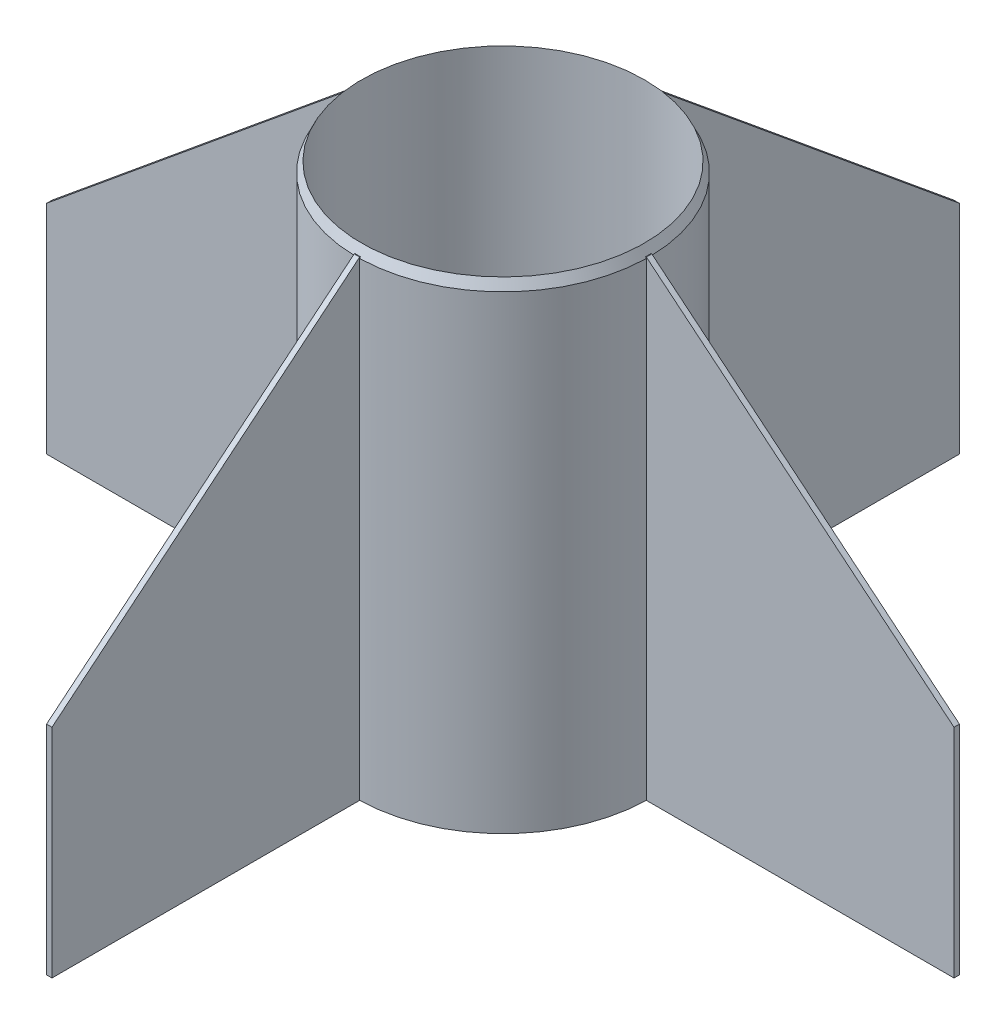
ISO-10303-21;
HEADER;
FILE_DESCRIPTION(('STEP AP214'),'2;1');
FILE_NAME('part.step','',(''),(''),'','','');
FILE_SCHEMA(('AUTOMOTIVE_DESIGN { 1 0 10303 214 1 1 1 1 }'));
ENDSEC;
DATA;
#1=APPLICATION_CONTEXT('core data for automotive mechanical design processes');
#2=APPLICATION_PROTOCOL_DEFINITION('international standard','automotive_design',2000,#1);
#3=PRODUCT_CONTEXT('',#1,'mechanical');
#4=PRODUCT('Part','Part','',(#3));
#5=PRODUCT_RELATED_PRODUCT_CATEGORY('part','',(#4));
#6=PRODUCT_DEFINITION_FORMATION('','',#4);
#7=PRODUCT_DEFINITION_CONTEXT('part definition',#1,'design');
#8=PRODUCT_DEFINITION('design','',#6,#7);
#9=PRODUCT_DEFINITION_SHAPE('','',#8);
#10=(LENGTH_UNIT() NAMED_UNIT(*) SI_UNIT(.MILLI.,.METRE.));
#11=(NAMED_UNIT(*) PLANE_ANGLE_UNIT() SI_UNIT($,.RADIAN.));
#12=(NAMED_UNIT(*) SI_UNIT($,.STERADIAN.) SOLID_ANGLE_UNIT());
#13=UNCERTAINTY_MEASURE_WITH_UNIT(LENGTH_MEASURE(1.E-05),#10,'distance_accuracy_value','');
#14=(GEOMETRIC_REPRESENTATION_CONTEXT(3) GLOBAL_UNCERTAINTY_ASSIGNED_CONTEXT((#13)) GLOBAL_UNIT_ASSIGNED_CONTEXT((#10,
#11,#12)) REPRESENTATION_CONTEXT('',''));
#15=CARTESIAN_POINT('',(0.,0.,0.));
#16=DIRECTION('',(0.,0.,1.));
#17=DIRECTION('',(1.,0.,0.));
#18=AXIS2_PLACEMENT_3D('',#15,#16,#17);
#19=CARTESIAN_POINT('',(0.,260.,0.));
#20=DIRECTION('',(0.,-1.,0.));
#21=DIRECTION('',(0.,0.,-1.));
#22=AXIS2_PLACEMENT_3D('',#19,#20,#21);
#23=CYLINDRICAL_SURFACE('',#22,80.7);
#24=DIRECTION('',(0.,-1.,0.));
#25=VECTOR('',#24,1.);
#26=CARTESIAN_POINT('',(-80.6860582752684,260.,-1.5));
#27=LINE('',#26,#25);
#28=CARTESIAN_POINT('',(-80.6860582752684,0.,-1.5));
#29=VERTEX_POINT('',#28);
#30=CARTESIAN_POINT('',(-80.6860582752684,259.277465397452,-1.5));
#31=VERTEX_POINT('',#30);
#32=EDGE_CURVE('E332',#29,#31,#27,.F.);
#33=ORIENTED_EDGE('',*,*,#32,.T.);
#34=CARTESIAN_POINT('',(0.,259.277465397452,0.));
#35=DIRECTION('',(0.,1.,0.));
#36=DIRECTION('',(0.,0.,1.));
#37=AXIS2_PLACEMENT_3D('',#34,#35,#36);
#38=CIRCLE('',#37,80.7);
#39=CARTESIAN_POINT('',(-1.49999999999915,259.277465397452,-80.6860582752684));
#40=VERTEX_POINT('',#39);
#41=EDGE_CURVE('E455',#31,#40,#38,.F.);
#42=ORIENTED_EDGE('',*,*,#41,.T.);
#43=DIRECTION('',(0.,-1.,0.));
#44=VECTOR('',#43,1.);
#45=CARTESIAN_POINT('',(-1.49999999999915,260.,-80.6860582752684));
#46=LINE('',#45,#44);
#47=CARTESIAN_POINT('',(-1.49999999999915,0.,-80.6860582752684));
#48=VERTEX_POINT('',#47);
#49=EDGE_CURVE('E291',#48,#40,#46,.F.);
#50=ORIENTED_EDGE('',*,*,#49,.F.);
#51=CARTESIAN_POINT('',(0.,0.,0.));
#52=DIRECTION('',(0.,1.,0.));
#53=DIRECTION('',(0.,0.,1.));
#54=AXIS2_PLACEMENT_3D('',#51,#52,#53);
#55=CIRCLE('',#54,80.7);
#56=EDGE_CURVE('E434',#48,#29,#55,.T.);
#57=ORIENTED_EDGE('',*,*,#56,.T.);
#58=EDGE_LOOP('',(#33,#42,#50,#57));
#59=FACE_BOUND('',#58,.T.);
#60=ADVANCED_FACE('F43',(#59),#23,.T.);
#61=DIRECTION('',(0.,-1.,0.));
#62=VECTOR('',#61,1.);
#63=CARTESIAN_POINT('',(1.50000000000085,260.,-80.6860582752683));
#64=LINE('',#63,#62);
#65=CARTESIAN_POINT('',(1.50000000000085,0.,-80.6860582752683));
#66=VERTEX_POINT('',#65);
#67=CARTESIAN_POINT('',(1.50000000000085,259.277465397452,-80.6860582752683));
#68=VERTEX_POINT('',#67);
#69=EDGE_CURVE('E241',#66,#68,#64,.F.);
#70=ORIENTED_EDGE('',*,*,#69,.T.);
#71=CARTESIAN_POINT('',(0.,259.277465397452,0.));
#72=DIRECTION('',(0.,1.,0.));
#73=DIRECTION('',(0.,0.,1.));
#74=AXIS2_PLACEMENT_3D('',#71,#72,#73);
#75=CIRCLE('',#74,80.7);
#76=CARTESIAN_POINT('',(80.6860582752684,259.277465397452,-1.5));
#77=VERTEX_POINT('',#76);
#78=EDGE_CURVE('E452',#68,#77,#75,.F.);
#79=ORIENTED_EDGE('',*,*,#78,.T.);
#80=DIRECTION('',(0.,-1.,0.));
#81=VECTOR('',#80,1.);
#82=CARTESIAN_POINT('',(80.6860582752684,260.,-1.5));
#83=LINE('',#82,#81);
#84=CARTESIAN_POINT('',(80.6860582752684,0.,-1.5));
#85=VERTEX_POINT('',#84);
#86=EDGE_CURVE('E438',#85,#77,#83,.F.);
#87=ORIENTED_EDGE('',*,*,#86,.F.);
#88=EDGE_CURVE('E430',#85,#66,#55,.T.);
#89=ORIENTED_EDGE('',*,*,#88,.T.);
#90=EDGE_LOOP('',(#70,#79,#87,#89));
#91=FACE_BOUND('',#90,.T.);
#92=ADVANCED_FACE('F611',(#91),#23,.T.);
#93=DIRECTION('',(0.,-1.,0.));
#94=VECTOR('',#93,1.);
#95=CARTESIAN_POINT('',(80.6860582752684,260.,1.5));
#96=LINE('',#95,#94);
#97=CARTESIAN_POINT('',(80.6860582752684,0.,1.5));
#98=VERTEX_POINT('',#97);
#99=CARTESIAN_POINT('',(80.6860582752684,259.277465397452,1.5));
#100=VERTEX_POINT('',#99);
#101=EDGE_CURVE('E433',#98,#100,#96,.F.);
#102=ORIENTED_EDGE('',*,*,#101,.T.);
#103=CARTESIAN_POINT('',(0.,259.277465397452,0.));
#104=DIRECTION('',(0.,1.,0.));
#105=DIRECTION('',(0.,0.,1.));
#106=AXIS2_PLACEMENT_3D('',#103,#104,#105);
#107=CIRCLE('',#106,80.7);
#108=CARTESIAN_POINT('',(1.49999999999972,259.277465397452,80.6860582752684));
#109=VERTEX_POINT('',#108);
#110=EDGE_CURVE('E449',#100,#109,#107,.F.);
#111=ORIENTED_EDGE('',*,*,#110,.T.);
#112=DIRECTION('',(0.,-1.,0.));
#113=VECTOR('',#112,1.);
#114=CARTESIAN_POINT('',(1.49999999999972,260.,80.6860582752684));
#115=LINE('',#114,#113);
#116=CARTESIAN_POINT('',(1.49999999999972,0.,80.6860582752684));
#117=VERTEX_POINT('',#116);
#118=EDGE_CURVE('E384',#117,#109,#115,.F.);
#119=ORIENTED_EDGE('',*,*,#118,.F.);
#120=EDGE_CURVE('E429',#117,#98,#55,.T.);
#121=ORIENTED_EDGE('',*,*,#120,.T.);
#122=EDGE_LOOP('',(#102,#111,#119,#121));
#123=FACE_BOUND('',#122,.T.);
#124=ADVANCED_FACE('F537',(#123),#23,.T.);
#125=DIRECTION('',(0.,-1.,0.));
#126=VECTOR('',#125,1.);
#127=CARTESIAN_POINT('',(-1.50000000000028,260.,80.6860582752684));
#128=LINE('',#127,#126);
#129=CARTESIAN_POINT('',(-1.50000000000028,0.,80.6860582752684));
#130=VERTEX_POINT('',#129);
#131=CARTESIAN_POINT('',(-1.50000000000028,259.277465397452,80.6860582752684));
#132=VERTEX_POINT('',#131);
#133=EDGE_CURVE('E380',#130,#132,#128,.F.);
#134=ORIENTED_EDGE('',*,*,#133,.T.);
#135=CARTESIAN_POINT('',(0.,259.277465397452,0.));
#136=DIRECTION('',(0.,1.,0.));
#137=DIRECTION('',(0.,0.,1.));
#138=AXIS2_PLACEMENT_3D('',#135,#136,#137);
#139=CIRCLE('',#138,80.7);
#140=CARTESIAN_POINT('',(-80.6860582752684,259.277465397452,1.5));
#141=VERTEX_POINT('',#140);
#142=EDGE_CURVE('E446',#132,#141,#139,.F.);
#143=ORIENTED_EDGE('',*,*,#142,.T.);
#144=DIRECTION('',(0.,-1.,0.));
#145=VECTOR('',#144,1.);
#146=CARTESIAN_POINT('',(-80.6860582752684,260.,1.5));
#147=LINE('',#146,#145);
#148=CARTESIAN_POINT('',(-80.6860582752684,0.,1.5));
#149=VERTEX_POINT('',#148);
#150=EDGE_CURVE('E336',#149,#141,#147,.F.);
#151=ORIENTED_EDGE('',*,*,#150,.F.);
#152=EDGE_CURVE('E527',#149,#130,#55,.T.);
#153=ORIENTED_EDGE('',*,*,#152,.T.);
#154=EDGE_LOOP('',(#134,#143,#151,#153));
#155=FACE_BOUND('',#154,.T.);
#156=ADVANCED_FACE('F617',(#155),#23,.T.);
#157=CARTESIAN_POINT('',(0.,260.,0.));
#158=DIRECTION('',(0.,1.,0.));
#159=DIRECTION('',(0.,0.,1.));
#160=AXIS2_PLACEMENT_3D('',#157,#158,#159);
#161=PLANE('',#160);
#162=DIRECTION('',(-1.,0.,0.));
#163=VECTOR('',#162,1.);
#164=CARTESIAN_POINT('',(80.7,260.,-1.5));
#165=LINE('',#164,#163);
#166=CARTESIAN_POINT('',(80.7,260.,-1.5));
#167=VERTEX_POINT('',#166);
#168=CARTESIAN_POINT('',(80.3490763957623,260.,-1.5));
#169=VERTEX_POINT('',#168);
#170=EDGE_CURVE('E98',#167,#169,#165,.T.);
#171=ORIENTED_EDGE('',*,*,#170,.T.);
#172=CARTESIAN_POINT('',(0.,260.,0.));
#173=DIRECTION('',(0.,1.,0.));
#174=DIRECTION('',(0.,0.,1.));
#175=AXIS2_PLACEMENT_3D('',#172,#173,#174);
#176=CIRCLE('',#175,80.3630765815499);
#177=CARTESIAN_POINT('',(80.3490763957623,260.,1.5));
#178=VERTEX_POINT('',#177);
#179=EDGE_CURVE('E555',#169,#178,#176,.F.);
#180=ORIENTED_EDGE('',*,*,#179,.T.);
#181=DIRECTION('',(-1.,0.,0.));
#182=VECTOR('',#181,1.);
#183=CARTESIAN_POINT('',(80.7,260.,1.5));
#184=LINE('',#183,#182);
#185=CARTESIAN_POINT('',(80.7,260.,1.5));
#186=VERTEX_POINT('',#185);
#187=EDGE_CURVE('E91',#186,#178,#184,.T.);
#188=ORIENTED_EDGE('',*,*,#187,.F.);
#189=DIRECTION('',(0.,0.,1.));
#190=VECTOR('',#189,1.);
#191=CARTESIAN_POINT('',(80.7,260.,-1.5));
#192=LINE('',#191,#190);
#193=CARTESIAN_POINT('',(80.7,260.,0.));
#194=VERTEX_POINT('',#193);
#195=EDGE_CURVE('E420',#194,#186,#192,.T.);
#196=ORIENTED_EDGE('',*,*,#195,.F.);
#197=EDGE_CURVE('E421',#167,#194,#192,.T.);
#198=ORIENTED_EDGE('',*,*,#197,.F.);
#199=EDGE_LOOP('',(#171,#180,#188,#196,#198));
#200=FACE_BOUND('',#199,.T.);
#201=ADVANCED_FACE('F553',(#200),#161,.T.);
#202=CARTESIAN_POINT('',(0.,0.,0.));
#203=DIRECTION('',(0.,1.,0.));
#204=DIRECTION('',(0.,0.,1.));
#205=AXIS2_PLACEMENT_3D('',#202,#203,#204);
#206=PLANE('',#205);
#207=ORIENTED_EDGE('',*,*,#152,.F.);
#208=DIRECTION('',(-1.,0.,0.));
#209=VECTOR('',#208,1.);
#210=CARTESIAN_POINT('',(-78.7,0.,1.5));
#211=LINE('',#210,#209);
#212=CARTESIAN_POINT('',(-250.7,0.,1.5));
#213=VERTEX_POINT('',#212);
#214=EDGE_CURVE('E324',#149,#213,#211,.T.);
#215=ORIENTED_EDGE('',*,*,#214,.T.);
#216=DIRECTION('',(0.,0.,-1.));
#217=VECTOR('',#216,1.);
#218=CARTESIAN_POINT('',(-250.7,0.,1.5));
#219=LINE('',#218,#217);
#220=CARTESIAN_POINT('',(-250.7,0.,-1.5));
#221=VERTEX_POINT('',#220);
#222=EDGE_CURVE('E310',#213,#221,#219,.T.);
#223=ORIENTED_EDGE('',*,*,#222,.T.);
#224=DIRECTION('',(-1.,0.,0.));
#225=VECTOR('',#224,1.);
#226=CARTESIAN_POINT('',(-78.7,0.,-1.5));
#227=LINE('',#226,#225);
#228=EDGE_CURVE('E319',#29,#221,#227,.T.);
#229=ORIENTED_EDGE('',*,*,#228,.F.);
#230=ORIENTED_EDGE('',*,*,#56,.F.);
#231=DIRECTION('',(0.,0.,-1.));
#232=VECTOR('',#231,1.);
#233=CARTESIAN_POINT('',(-1.49999999999918,0.,-78.7));
#234=LINE('',#233,#232);
#235=CARTESIAN_POINT('',(-1.49999999999737,0.,-250.7));
#236=VERTEX_POINT('',#235);
#237=EDGE_CURVE('E255',#48,#236,#234,.T.);
#238=ORIENTED_EDGE('',*,*,#237,.T.);
#239=DIRECTION('',(1.,0.,0.));
#240=VECTOR('',#239,1.);
#241=CARTESIAN_POINT('',(-1.49999999999737,0.,-250.7));
#242=LINE('',#241,#240);
#243=CARTESIAN_POINT('',(1.50000000000263,0.,-250.7));
#244=VERTEX_POINT('',#243);
#245=EDGE_CURVE('E250',#236,#244,#242,.T.);
#246=ORIENTED_EDGE('',*,*,#245,.T.);
#247=DIRECTION('',(0.,0.,-1.));
#248=VECTOR('',#247,1.);
#249=CARTESIAN_POINT('',(1.50000000000082,0.,-78.7));
#250=LINE('',#249,#248);
#251=EDGE_CURVE('E233',#66,#244,#250,.T.);
#252=ORIENTED_EDGE('',*,*,#251,.F.);
#253=ORIENTED_EDGE('',*,*,#88,.F.);
#254=DIRECTION('',(1.,0.,0.));
#255=VECTOR('',#254,1.);
#256=CARTESIAN_POINT('',(78.7,0.,-1.5));
#257=LINE('',#256,#255);
#258=CARTESIAN_POINT('',(250.7,0.,-1.5));
#259=VERTEX_POINT('',#258);
#260=EDGE_CURVE('E417',#85,#259,#257,.T.);
#261=ORIENTED_EDGE('',*,*,#260,.T.);
#262=DIRECTION('',(0.,0.,1.));
#263=VECTOR('',#262,1.);
#264=CARTESIAN_POINT('',(250.7,0.,-1.5));
#265=LINE('',#264,#263);
#266=CARTESIAN_POINT('',(250.7,0.,1.5));
#267=VERTEX_POINT('',#266);
#268=EDGE_CURVE('E403',#259,#267,#265,.T.);
#269=ORIENTED_EDGE('',*,*,#268,.T.);
#270=DIRECTION('',(1.,0.,0.));
#271=VECTOR('',#270,1.);
#272=CARTESIAN_POINT('',(78.7,0.,1.5));
#273=LINE('',#272,#271);
#274=EDGE_CURVE('E412',#98,#267,#273,.T.);
#275=ORIENTED_EDGE('',*,*,#274,.F.);
#276=ORIENTED_EDGE('',*,*,#120,.F.);
#277=DIRECTION('',(0.,0.,1.));
#278=VECTOR('',#277,1.);
#279=CARTESIAN_POINT('',(1.49999999999973,0.,78.7));
#280=LINE('',#279,#278);
#281=CARTESIAN_POINT('',(1.49999999999912,0.,250.7));
#282=VERTEX_POINT('',#281);
#283=EDGE_CURVE('E372',#117,#282,#280,.T.);
#284=ORIENTED_EDGE('',*,*,#283,.T.);
#285=DIRECTION('',(-1.,0.,0.));
#286=VECTOR('',#285,1.);
#287=CARTESIAN_POINT('',(1.49999999999912,0.,250.7));
#288=LINE('',#287,#286);
#289=CARTESIAN_POINT('',(-1.50000000000088,0.,250.7));
#290=VERTEX_POINT('',#289);
#291=EDGE_CURVE('E356',#282,#290,#288,.T.);
#292=ORIENTED_EDGE('',*,*,#291,.T.);
#293=DIRECTION('',(0.,0.,1.));
#294=VECTOR('',#293,1.);
#295=CARTESIAN_POINT('',(-1.50000000000027,0.,78.7));
#296=LINE('',#295,#294);
#297=EDGE_CURVE('E366',#130,#290,#296,.T.);
#298=ORIENTED_EDGE('',*,*,#297,.F.);
#299=EDGE_LOOP('',(#207,#215,#223,#229,#230,#238,#246,#252,#253,#261,#269,#275,#276,#284,#292,#298));
#300=FACE_BOUND('',#299,.T.);
#301=CARTESIAN_POINT('',(0.,0.,0.));
#302=DIRECTION('',(0.,1.,0.));
#303=DIRECTION('',(0.,0.,1.));
#304=AXIS2_PLACEMENT_3D('',#301,#302,#303);
#305=CIRCLE('',#304,78.2);
#306=CARTESIAN_POINT('',(0.,0.,78.2));
#307=VERTEX_POINT('',#306);
#308=EDGE_CURVE('E425',#307,#307,#305,.T.);
#309=ORIENTED_EDGE('',*,*,#308,.T.);
#310=EDGE_LOOP('',(#309));
#311=FACE_BOUND('',#310,.T.);
#312=ADVANCED_FACE('F252',(#300,#311),#206,.F.);
#313=CARTESIAN_POINT('',(0.,260.,0.));
#314=DIRECTION('',(0.,-1.,0.));
#315=DIRECTION('',(0.,0.,-1.));
#316=AXIS2_PLACEMENT_3D('',#313,#314,#315);
#317=CYLINDRICAL_SURFACE('',#316,78.2);
#318=CARTESIAN_POINT('',(0.,264.638732698726,0.));
#319=DIRECTION('',(0.,-1.,0.));
#320=DIRECTION('',(0.,0.,-1.));
#321=AXIS2_PLACEMENT_3D('',#318,#319,#320);
#322=CIRCLE('',#321,78.2);
#323=CARTESIAN_POINT('',(0.,264.638732698726,-78.2));
#324=VERTEX_POINT('',#323);
#325=EDGE_CURVE('E442',#324,#324,#322,.F.);
#326=ORIENTED_EDGE('',*,*,#325,.T.);
#327=EDGE_LOOP('',(#326));
#328=FACE_BOUND('',#327,.T.);
#329=ORIENTED_EDGE('',*,*,#308,.F.);
#330=EDGE_LOOP('',(#329));
#331=FACE_BOUND('',#330,.T.);
#332=ADVANCED_FACE('F588',(#328,#331),#317,.F.);
#333=CARTESIAN_POINT('',(0.,0.,-1.5));
#334=DIRECTION('',(0.,0.,1.));
#335=DIRECTION('',(1.,0.,0.));
#336=AXIS2_PLACEMENT_3D('',#333,#334,#335);
#337=PLANE('',#336);
#338=ORIENTED_EDGE('',*,*,#260,.F.);
#339=ORIENTED_EDGE('',*,*,#86,.T.);
#340=CARTESIAN_POINT('',(80.6860582752684,259.277465397452,-1.5));
#341=CARTESIAN_POINT('',(80.6298946621743,259.397887846829,-1.5));
#342=CARTESIAN_POINT('',(80.573731032335,259.518310288397,-1.5));
#343=CARTESIAN_POINT('',(80.4614037391664,259.759155155913,-1.5));
#344=CARTESIAN_POINT('',(80.4052400758369,259.879577581861,-1.5));
#345=CARTESIAN_POINT('',(80.3490763957623,260.,-1.5));
#346=B_SPLINE_CURVE_WITH_KNOTS('',3,(#340,#341,#342,#343,#344,#345),.UNSPECIFIED.,.F.,.F.,(4,2,
4),(0.,0.398626717304128,0.797253434608295),.UNSPECIFIED.);
#347=EDGE_CURVE('E558',#77,#169,#346,.T.);
#348=ORIENTED_EDGE('',*,*,#347,.T.);
#349=ORIENTED_EDGE('',*,*,#170,.F.);
#350=DIRECTION('',(-0.77193023561705,0.6357072528611,0.));
#351=VECTOR('',#350,1.);
#352=CARTESIAN_POINT('',(250.7,120.,-1.5));
#353=LINE('',#352,#351);
#354=CARTESIAN_POINT('',(250.7,120.,-1.5));
#355=VERTEX_POINT('',#354);
#356=EDGE_CURVE('E399',#355,#167,#353,.T.);
#357=ORIENTED_EDGE('',*,*,#356,.F.);
#358=DIRECTION('',(0.,1.,0.));
#359=VECTOR('',#358,1.);
#360=CARTESIAN_POINT('',(250.7,0.,-1.5));
#361=LINE('',#360,#359);
#362=EDGE_CURVE('E395',#259,#355,#361,.T.);
#363=ORIENTED_EDGE('',*,*,#362,.F.);
#364=EDGE_LOOP('',(#338,#339,#348,#349,#357,#363));
#365=FACE_BOUND('',#364,.T.);
#366=ADVANCED_FACE('F583',(#365),#337,.F.);
#367=CARTESIAN_POINT('',(0.,0.,1.5));
#368=DIRECTION('',(0.,0.,1.));
#369=DIRECTION('',(1.,0.,0.));
#370=AXIS2_PLACEMENT_3D('',#367,#368,#369);
#371=PLANE('',#370);
#372=ORIENTED_EDGE('',*,*,#101,.F.);
#373=ORIENTED_EDGE('',*,*,#274,.T.);
#374=DIRECTION('',(0.,1.,0.));
#375=VECTOR('',#374,1.);
#376=CARTESIAN_POINT('',(250.7,0.,1.5));
#377=LINE('',#376,#375);
#378=CARTESIAN_POINT('',(250.7,120.,1.5));
#379=VERTEX_POINT('',#378);
#380=EDGE_CURVE('E388',#267,#379,#377,.T.);
#381=ORIENTED_EDGE('',*,*,#380,.T.);
#382=DIRECTION('',(-0.77193023561705,0.6357072528611,0.));
#383=VECTOR('',#382,1.);
#384=CARTESIAN_POINT('',(250.7,120.,1.5));
#385=LINE('',#384,#383);
#386=EDGE_CURVE('E392',#379,#186,#385,.T.);
#387=ORIENTED_EDGE('',*,*,#386,.T.);
#388=ORIENTED_EDGE('',*,*,#187,.T.);
#389=CARTESIAN_POINT('',(80.3490763957623,260.,1.5));
#390=CARTESIAN_POINT('',(80.4052400758369,259.879577581861,1.5));
#391=CARTESIAN_POINT('',(80.4614037391664,259.759155155913,1.5));
#392=CARTESIAN_POINT('',(80.573731032335,259.518310288397,1.5));
#393=CARTESIAN_POINT('',(80.6298946621743,259.397887846829,1.5));
#394=CARTESIAN_POINT('',(80.6860582752684,259.277465397452,1.5));
#395=B_SPLINE_CURVE_WITH_KNOTS('',3,(#389,#390,#391,#392,#393,#394),.UNSPECIFIED.,.F.,.F.,(4,2,
4),(0.,0.398626717304167,0.797253434608301),.UNSPECIFIED.);
#396=EDGE_CURVE('E542',#178,#100,#395,.T.);
#397=ORIENTED_EDGE('',*,*,#396,.T.);
#398=EDGE_LOOP('',(#372,#373,#381,#387,#388,#397));
#399=FACE_BOUND('',#398,.T.);
#400=ADVANCED_FACE('F540',(#399),#371,.T.);
#401=CARTESIAN_POINT('',(250.7,120.,-1.5));
#402=DIRECTION('',(0.6357072528611,0.77193023561705,0.));
#403=DIRECTION('',(-0.77193023561705,0.6357072528611,0.));
#404=AXIS2_PLACEMENT_3D('',#401,#402,#403);
#405=PLANE('',#404);
#406=ORIENTED_EDGE('',*,*,#197,.T.);
#407=ORIENTED_EDGE('',*,*,#195,.T.);
#408=ORIENTED_EDGE('',*,*,#386,.F.);
#409=DIRECTION('',(0.,0.,1.));
#410=VECTOR('',#409,1.);
#411=CARTESIAN_POINT('',(250.7,120.,-1.5));
#412=LINE('',#411,#410);
#413=EDGE_CURVE('E404',#355,#379,#412,.T.);
#414=ORIENTED_EDGE('',*,*,#413,.F.);
#415=ORIENTED_EDGE('',*,*,#356,.T.);
#416=EDGE_LOOP('',(#406,#407,#408,#414,#415));
#417=FACE_BOUND('',#416,.T.);
#418=ADVANCED_FACE('F550',(#417),#405,.T.);
#419=CARTESIAN_POINT('',(250.7,0.,-1.5));
#420=DIRECTION('',(1.,0.,0.));
#421=DIRECTION('',(0.,0.,-1.));
#422=AXIS2_PLACEMENT_3D('',#419,#420,#421);
#423=PLANE('',#422);
#424=ORIENTED_EDGE('',*,*,#413,.T.);
#425=ORIENTED_EDGE('',*,*,#380,.F.);
#426=ORIENTED_EDGE('',*,*,#268,.F.);
#427=ORIENTED_EDGE('',*,*,#362,.T.);
#428=EDGE_LOOP('',(#424,#425,#426,#427));
#429=FACE_BOUND('',#428,.T.);
#430=ADVANCED_FACE('F547',(#429),#423,.T.);
#431=CARTESIAN_POINT('',(0.,260.,0.));
#432=DIRECTION('',(0.,1.,0.));
#433=DIRECTION('',(-1.,0.,0.));
#434=AXIS2_PLACEMENT_3D('',#431,#432,#433);
#435=PLANE('',#434);
#436=DIRECTION('',(0.,0.,-1.));
#437=VECTOR('',#436,1.);
#438=CARTESIAN_POINT('',(1.49999999999972,260.,80.7));
#439=LINE('',#438,#437);
#440=CARTESIAN_POINT('',(1.49999999999972,260.,80.7));
#441=VERTEX_POINT('',#440);
#442=CARTESIAN_POINT('',(1.49999999999972,260.,80.3490763957623));
#443=VERTEX_POINT('',#442);
#444=EDGE_CURVE('E369',#441,#443,#439,.T.);
#445=ORIENTED_EDGE('',*,*,#444,.T.);
#446=CARTESIAN_POINT('',(0.,260.,0.));
#447=DIRECTION('',(0.,1.,0.));
#448=DIRECTION('',(0.,0.,1.));
#449=AXIS2_PLACEMENT_3D('',#446,#447,#448);
#450=CIRCLE('',#449,80.3630765815499);
#451=CARTESIAN_POINT('',(-1.50000000000028,260.,80.3490763957623));
#452=VERTEX_POINT('',#451);
#453=EDGE_CURVE('E566',#443,#452,#450,.F.);
#454=ORIENTED_EDGE('',*,*,#453,.T.);
#455=DIRECTION('',(0.,0.,-1.));
#456=VECTOR('',#455,1.);
#457=CARTESIAN_POINT('',(-1.50000000000028,260.,80.7));
#458=LINE('',#457,#456);
#459=CARTESIAN_POINT('',(-1.50000000000028,260.,80.7));
#460=VERTEX_POINT('',#459);
#461=EDGE_CURVE('E360',#460,#452,#458,.T.);
#462=ORIENTED_EDGE('',*,*,#461,.F.);
#463=DIRECTION('',(-1.,0.,0.));
#464=VECTOR('',#463,1.);
#465=CARTESIAN_POINT('',(1.49999999999972,260.,80.7));
#466=LINE('',#465,#464);
#467=CARTESIAN_POINT('',(-2.81762544044641E-13,260.,80.7));
#468=VERTEX_POINT('',#467);
#469=EDGE_CURVE('E375',#468,#460,#466,.T.);
#470=ORIENTED_EDGE('',*,*,#469,.F.);
#471=EDGE_CURVE('E376',#441,#468,#466,.T.);
#472=ORIENTED_EDGE('',*,*,#471,.F.);
#473=EDGE_LOOP('',(#445,#454,#462,#470,#472));
#474=FACE_BOUND('',#473,.T.);
#475=ADVANCED_FACE('F657',(#474),#435,.T.);
#476=CARTESIAN_POINT('',(1.5,0.,0.));
#477=DIRECTION('',(-1.,0.,0.));
#478=DIRECTION('',(0.,0.,1.));
#479=AXIS2_PLACEMENT_3D('',#476,#477,#478);
#480=PLANE('',#479);
#481=ORIENTED_EDGE('',*,*,#283,.F.);
#482=ORIENTED_EDGE('',*,*,#118,.T.);
#483=CARTESIAN_POINT('',(1.49999999999972,259.277465397452,80.6860582752684));
#484=CARTESIAN_POINT('',(1.49999999999972,259.397887846829,80.6298946621743));
#485=CARTESIAN_POINT('',(1.49999999999972,259.518310288397,80.573731032335));
#486=CARTESIAN_POINT('',(1.49999999999972,259.759155155913,80.4614037391664));
#487=CARTESIAN_POINT('',(1.49999999999972,259.879577581861,80.4052400758369));
#488=CARTESIAN_POINT('',(1.49999999999972,260.,80.3490763957623));
#489=B_SPLINE_CURVE_WITH_KNOTS('',3,(#483,#484,#485,#486,#487,#488),.UNSPECIFIED.,.F.,.F.,(4,2,
4),(0.,0.398626717304128,0.797253434608295),.UNSPECIFIED.);
#490=EDGE_CURVE('E562',#109,#443,#489,.T.);
#491=ORIENTED_EDGE('',*,*,#490,.T.);
#492=ORIENTED_EDGE('',*,*,#444,.F.);
#493=DIRECTION('',(0.,0.6357072528611,-0.77193023561705));
#494=VECTOR('',#493,1.);
#495=CARTESIAN_POINT('',(1.49999999999912,120.,250.7));
#496=LINE('',#495,#494);
#497=CARTESIAN_POINT('',(1.49999999999912,120.,250.7));
#498=VERTEX_POINT('',#497);
#499=EDGE_CURVE('E352',#498,#441,#496,.T.);
#500=ORIENTED_EDGE('',*,*,#499,.F.);
#501=DIRECTION('',(0.,1.,0.));
#502=VECTOR('',#501,1.);
#503=CARTESIAN_POINT('',(1.49999999999912,0.,250.7));
#504=LINE('',#503,#502);
#505=EDGE_CURVE('E348',#282,#498,#504,.T.);
#506=ORIENTED_EDGE('',*,*,#505,.F.);
#507=EDGE_LOOP('',(#481,#482,#491,#492,#500,#506));
#508=FACE_BOUND('',#507,.T.);
#509=ADVANCED_FACE('F662',(#508),#480,.F.);
#510=CARTESIAN_POINT('',(-1.5,0.,0.));
#511=DIRECTION('',(-1.,0.,0.));
#512=DIRECTION('',(0.,0.,1.));
#513=AXIS2_PLACEMENT_3D('',#510,#511,#512);
#514=PLANE('',#513);
#515=ORIENTED_EDGE('',*,*,#133,.F.);
#516=ORIENTED_EDGE('',*,*,#297,.T.);
#517=DIRECTION('',(0.,1.,0.));
#518=VECTOR('',#517,1.);
#519=CARTESIAN_POINT('',(-1.50000000000088,0.,250.7));
#520=LINE('',#519,#518);
#521=CARTESIAN_POINT('',(-1.50000000000088,120.,250.7));
#522=VERTEX_POINT('',#521);
#523=EDGE_CURVE('E340',#290,#522,#520,.T.);
#524=ORIENTED_EDGE('',*,*,#523,.T.);
#525=DIRECTION('',(0.,0.6357072528611,-0.77193023561705));
#526=VECTOR('',#525,1.);
#527=CARTESIAN_POINT('',(-1.50000000000088,120.,250.7));
#528=LINE('',#527,#526);
#529=EDGE_CURVE('E344',#522,#460,#528,.T.);
#530=ORIENTED_EDGE('',*,*,#529,.T.);
#531=ORIENTED_EDGE('',*,*,#461,.T.);
#532=CARTESIAN_POINT('',(-1.50000000000028,260.,80.3490763957623));
#533=CARTESIAN_POINT('',(-1.50000000000028,259.879577581861,80.4052400758369));
#534=CARTESIAN_POINT('',(-1.50000000000028,259.759155155913,80.4614037391664));
#535=CARTESIAN_POINT('',(-1.50000000000028,259.518310288397,80.573731032335));
#536=CARTESIAN_POINT('',(-1.50000000000028,259.397887846829,80.6298946621743));
#537=CARTESIAN_POINT('',(-1.50000000000028,259.277465397452,80.6860582752684));
#538=B_SPLINE_CURVE_WITH_KNOTS('',3,(#532,#533,#534,#535,#536,#537),.UNSPECIFIED.,.F.,.F.,(4,2,
4),(0.,0.398626717304167,0.797253434608295),.UNSPECIFIED.);
#539=EDGE_CURVE('E508',#452,#132,#538,.T.);
#540=ORIENTED_EDGE('',*,*,#539,.T.);
#541=EDGE_LOOP('',(#515,#516,#524,#530,#531,#540));
#542=FACE_BOUND('',#541,.T.);
#543=ADVANCED_FACE('F670',(#542),#514,.T.);
#544=CARTESIAN_POINT('',(1.49999999999912,120.,250.7));
#545=DIRECTION('',(0.,0.77193023561705,0.6357072528611));
#546=DIRECTION('',(0.,0.6357072528611,-0.77193023561705));
#547=AXIS2_PLACEMENT_3D('',#544,#545,#546);
#548=PLANE('',#547);
#549=ORIENTED_EDGE('',*,*,#471,.T.);
#550=ORIENTED_EDGE('',*,*,#469,.T.);
#551=ORIENTED_EDGE('',*,*,#529,.F.);
#552=DIRECTION('',(-1.,0.,0.));
#553=VECTOR('',#552,1.);
#554=CARTESIAN_POINT('',(1.49999999999912,120.,250.7));
#555=LINE('',#554,#553);
#556=EDGE_CURVE('E357',#498,#522,#555,.T.);
#557=ORIENTED_EDGE('',*,*,#556,.F.);
#558=ORIENTED_EDGE('',*,*,#499,.T.);
#559=EDGE_LOOP('',(#549,#550,#551,#557,#558));
#560=FACE_BOUND('',#559,.T.);
#561=ADVANCED_FACE('F677',(#560),#548,.T.);
#562=CARTESIAN_POINT('',(1.49999999999912,0.,250.7));
#563=DIRECTION('',(0.,0.,1.));
#564=DIRECTION('',(1.,0.,0.));
#565=AXIS2_PLACEMENT_3D('',#562,#563,#564);
#566=PLANE('',#565);
#567=ORIENTED_EDGE('',*,*,#556,.T.);
#568=ORIENTED_EDGE('',*,*,#523,.F.);
#569=ORIENTED_EDGE('',*,*,#291,.F.);
#570=ORIENTED_EDGE('',*,*,#505,.T.);
#571=EDGE_LOOP('',(#567,#568,#569,#570));
#572=FACE_BOUND('',#571,.T.);
#573=ADVANCED_FACE('F684',(#572),#566,.T.);
#574=CARTESIAN_POINT('',(0.,260.,0.));
#575=DIRECTION('',(0.,1.,0.));
#576=DIRECTION('',(0.,0.,-1.));
#577=AXIS2_PLACEMENT_3D('',#574,#575,#576);
#578=PLANE('',#577);
#579=DIRECTION('',(1.,0.,0.));
#580=VECTOR('',#579,1.);
#581=CARTESIAN_POINT('',(-80.7,260.,1.5));
#582=LINE('',#581,#580);
#583=CARTESIAN_POINT('',(-80.7,260.,1.5));
#584=VERTEX_POINT('',#583);
#585=CARTESIAN_POINT('',(-80.3490763957623,260.,1.5));
#586=VERTEX_POINT('',#585);
#587=EDGE_CURVE('E73',#584,#586,#582,.T.);
#588=ORIENTED_EDGE('',*,*,#587,.T.);
#589=CARTESIAN_POINT('',(0.,260.,0.));
#590=DIRECTION('',(0.,1.,0.));
#591=DIRECTION('',(0.,0.,1.));
#592=AXIS2_PLACEMENT_3D('',#589,#590,#591);
#593=CIRCLE('',#592,80.3630765815499);
#594=CARTESIAN_POINT('',(-80.3490763957623,260.,-1.5));
#595=VERTEX_POINT('',#594);
#596=EDGE_CURVE('E59',#586,#595,#593,.F.);
#597=ORIENTED_EDGE('',*,*,#596,.T.);
#598=DIRECTION('',(1.,0.,0.));
#599=VECTOR('',#598,1.);
#600=CARTESIAN_POINT('',(-80.7,260.,-1.5));
#601=LINE('',#600,#599);
#602=CARTESIAN_POINT('',(-80.7,260.,-1.5));
#603=VERTEX_POINT('',#602);
#604=EDGE_CURVE('E65',#603,#595,#601,.T.);
#605=ORIENTED_EDGE('',*,*,#604,.F.);
#606=DIRECTION('',(0.,0.,-1.));
#607=VECTOR('',#606,1.);
#608=CARTESIAN_POINT('',(-80.7,260.,1.5));
#609=LINE('',#608,#607);
#610=CARTESIAN_POINT('',(-80.7,260.,0.));
#611=VERTEX_POINT('',#610);
#612=EDGE_CURVE('E327',#611,#603,#609,.T.);
#613=ORIENTED_EDGE('',*,*,#612,.F.);
#614=EDGE_CURVE('E328',#584,#611,#609,.T.);
#615=ORIENTED_EDGE('',*,*,#614,.F.);
#616=EDGE_LOOP('',(#588,#597,#605,#613,#615));
#617=FACE_BOUND('',#616,.T.);
#618=ADVANCED_FACE('F497',(#617),#578,.T.);
#619=CARTESIAN_POINT('',(0.,0.,1.5));
#620=DIRECTION('',(0.,0.,-1.));
#621=DIRECTION('',(-1.,0.,0.));
#622=AXIS2_PLACEMENT_3D('',#619,#620,#621);
#623=PLANE('',#622);
#624=ORIENTED_EDGE('',*,*,#214,.F.);
#625=ORIENTED_EDGE('',*,*,#150,.T.);
#626=CARTESIAN_POINT('',(-80.6860582752684,259.277465397452,1.5));
#627=CARTESIAN_POINT('',(-80.6298946621743,259.397887846829,1.5));
#628=CARTESIAN_POINT('',(-80.573731032335,259.518310288397,1.5));
#629=CARTESIAN_POINT('',(-80.4614037391664,259.759155155913,1.5));
#630=CARTESIAN_POINT('',(-80.4052400758369,259.879577581861,1.5));
#631=CARTESIAN_POINT('',(-80.3490763957623,260.,1.5));
#632=B_SPLINE_CURVE_WITH_KNOTS('',3,(#626,#627,#628,#629,#630,#631),.UNSPECIFIED.,.F.,.F.,(4,2,
4),(0.,0.398626717304128,0.797253434608295),.UNSPECIFIED.);
#633=EDGE_CURVE('E501',#141,#586,#632,.T.);
#634=ORIENTED_EDGE('',*,*,#633,.T.);
#635=ORIENTED_EDGE('',*,*,#587,.F.);
#636=DIRECTION('',(0.77193023561705,0.6357072528611,0.));
#637=VECTOR('',#636,1.);
#638=CARTESIAN_POINT('',(-250.7,120.,1.5));
#639=LINE('',#638,#637);
#640=CARTESIAN_POINT('',(-250.7,120.,1.5));
#641=VERTEX_POINT('',#640);
#642=EDGE_CURVE('E306',#641,#584,#639,.T.);
#643=ORIENTED_EDGE('',*,*,#642,.F.);
#644=DIRECTION('',(0.,1.,0.));
#645=VECTOR('',#644,1.);
#646=CARTESIAN_POINT('',(-250.7,0.,1.5));
#647=LINE('',#646,#645);
#648=EDGE_CURVE('E302',#213,#641,#647,.T.);
#649=ORIENTED_EDGE('',*,*,#648,.F.);
#650=EDGE_LOOP('',(#624,#625,#634,#635,#643,#649));
#651=FACE_BOUND('',#650,.T.);
#652=ADVANCED_FACE('F493',(#651),#623,.F.);
#653=CARTESIAN_POINT('',(0.,0.,-1.5));
#654=DIRECTION('',(0.,0.,-1.));
#655=DIRECTION('',(-1.,0.,0.));
#656=AXIS2_PLACEMENT_3D('',#653,#654,#655);
#657=PLANE('',#656);
#658=ORIENTED_EDGE('',*,*,#32,.F.);
#659=ORIENTED_EDGE('',*,*,#228,.T.);
#660=DIRECTION('',(0.,1.,0.));
#661=VECTOR('',#660,1.);
#662=CARTESIAN_POINT('',(-250.7,0.,-1.5));
#663=LINE('',#662,#661);
#664=CARTESIAN_POINT('',(-250.7,120.,-1.5));
#665=VERTEX_POINT('',#664);
#666=EDGE_CURVE('E295',#221,#665,#663,.T.);
#667=ORIENTED_EDGE('',*,*,#666,.T.);
#668=DIRECTION('',(0.77193023561705,0.6357072528611,0.));
#669=VECTOR('',#668,1.);
#670=CARTESIAN_POINT('',(-250.7,120.,-1.5));
#671=LINE('',#670,#669);
#672=EDGE_CURVE('E299',#665,#603,#671,.T.);
#673=ORIENTED_EDGE('',*,*,#672,.T.);
#674=ORIENTED_EDGE('',*,*,#604,.T.);
#675=CARTESIAN_POINT('',(-80.3490763957623,260.,-1.5));
#676=CARTESIAN_POINT('',(-80.4052400758369,259.879577581861,-1.5));
#677=CARTESIAN_POINT('',(-80.4614037391664,259.759155155913,-1.5));
#678=CARTESIAN_POINT('',(-80.573731032335,259.518310288397,-1.5));
#679=CARTESIAN_POINT('',(-80.6298946621743,259.397887846829,-1.5));
#680=CARTESIAN_POINT('',(-80.6860582752684,259.277465397452,-1.5));
#681=B_SPLINE_CURVE_WITH_KNOTS('',3,(#675,#676,#677,#678,#679,#680),.UNSPECIFIED.,.F.,.F.,(4,2,
4),(0.,0.398626717304167,0.797253434608301),.UNSPECIFIED.);
#682=EDGE_CURVE('E11',#595,#31,#681,.T.);
#683=ORIENTED_EDGE('',*,*,#682,.T.);
#684=EDGE_LOOP('',(#658,#659,#667,#673,#674,#683));
#685=FACE_BOUND('',#684,.T.);
#686=ADVANCED_FACE('F486',(#685),#657,.T.);
#687=CARTESIAN_POINT('',(-250.7,120.,1.5));
#688=DIRECTION('',(-0.6357072528611,0.77193023561705,0.));
#689=DIRECTION('',(0.77193023561705,0.6357072528611,0.));
#690=AXIS2_PLACEMENT_3D('',#687,#688,#689);
#691=PLANE('',#690);
#692=ORIENTED_EDGE('',*,*,#614,.T.);
#693=ORIENTED_EDGE('',*,*,#612,.T.);
#694=ORIENTED_EDGE('',*,*,#672,.F.);
#695=DIRECTION('',(0.,0.,-1.));
#696=VECTOR('',#695,1.);
#697=CARTESIAN_POINT('',(-250.7,120.,1.5));
#698=LINE('',#697,#696);
#699=EDGE_CURVE('E311',#641,#665,#698,.T.);
#700=ORIENTED_EDGE('',*,*,#699,.F.);
#701=ORIENTED_EDGE('',*,*,#642,.T.);
#702=EDGE_LOOP('',(#692,#693,#694,#700,#701));
#703=FACE_BOUND('',#702,.T.);
#704=ADVANCED_FACE('F483',(#703),#691,.T.);
#705=CARTESIAN_POINT('',(-250.7,0.,1.5));
#706=DIRECTION('',(-1.,0.,0.));
#707=DIRECTION('',(0.,0.,1.));
#708=AXIS2_PLACEMENT_3D('',#705,#706,#707);
#709=PLANE('',#708);
#710=ORIENTED_EDGE('',*,*,#699,.T.);
#711=ORIENTED_EDGE('',*,*,#666,.F.);
#712=ORIENTED_EDGE('',*,*,#222,.F.);
#713=ORIENTED_EDGE('',*,*,#648,.T.);
#714=EDGE_LOOP('',(#710,#711,#712,#713));
#715=FACE_BOUND('',#714,.T.);
#716=ADVANCED_FACE('F481',(#715),#709,.T.);
#717=CARTESIAN_POINT('',(0.,260.,0.));
#718=DIRECTION('',(0.,1.,0.));
#719=DIRECTION('',(1.,0.,0.));
#720=AXIS2_PLACEMENT_3D('',#717,#718,#719);
#721=PLANE('',#720);
#722=DIRECTION('',(0.,0.,1.));
#723=VECTOR('',#722,1.);
#724=CARTESIAN_POINT('',(-1.49999999999915,260.,-80.7));
#725=LINE('',#724,#723);
#726=CARTESIAN_POINT('',(-1.49999999999915,260.,-80.7));
#727=VERTEX_POINT('',#726);
#728=CARTESIAN_POINT('',(-1.49999999999916,260.,-80.3490763957623));
#729=VERTEX_POINT('',#728);
#730=EDGE_CURVE('E246',#727,#729,#725,.T.);
#731=ORIENTED_EDGE('',*,*,#730,.T.);
#732=CARTESIAN_POINT('',(0.,260.,0.));
#733=DIRECTION('',(0.,1.,0.));
#734=DIRECTION('',(0.,0.,1.));
#735=AXIS2_PLACEMENT_3D('',#732,#733,#734);
#736=CIRCLE('',#735,80.3630765815499);
#737=CARTESIAN_POINT('',(1.50000000000084,260.,-80.3490763957623));
#738=VERTEX_POINT('',#737);
#739=EDGE_CURVE('E468',#729,#738,#736,.F.);
#740=ORIENTED_EDGE('',*,*,#739,.T.);
#741=DIRECTION('',(0.,0.,1.));
#742=VECTOR('',#741,1.);
#743=CARTESIAN_POINT('',(1.50000000000085,260.,-80.7));
#744=LINE('',#743,#742);
#745=CARTESIAN_POINT('',(1.50000000000085,260.,-80.7));
#746=VERTEX_POINT('',#745);
#747=EDGE_CURVE('E247',#746,#738,#744,.T.);
#748=ORIENTED_EDGE('',*,*,#747,.F.);
#749=DIRECTION('',(1.,0.,0.));
#750=VECTOR('',#749,1.);
#751=CARTESIAN_POINT('',(-1.49999999999915,260.,-80.7));
#752=LINE('',#751,#750);
#753=CARTESIAN_POINT('',(8.45287632133923E-13,260.,-80.7));
#754=VERTEX_POINT('',#753);
#755=EDGE_CURVE('E284',#754,#746,#752,.T.);
#756=ORIENTED_EDGE('',*,*,#755,.F.);
#757=EDGE_CURVE('E285',#727,#754,#752,.T.);
#758=ORIENTED_EDGE('',*,*,#757,.F.);
#759=EDGE_LOOP('',(#731,#740,#748,#756,#758));
#760=FACE_BOUND('',#759,.T.);
#761=ADVANCED_FACE('F475',(#760),#721,.T.);
#762=CARTESIAN_POINT('',(-1.5,0.,0.));
#763=DIRECTION('',(1.,0.,0.));
#764=DIRECTION('',(0.,0.,-1.));
#765=AXIS2_PLACEMENT_3D('',#762,#763,#764);
#766=PLANE('',#765);
#767=ORIENTED_EDGE('',*,*,#237,.F.);
#768=ORIENTED_EDGE('',*,*,#49,.T.);
#769=CARTESIAN_POINT('',(-1.49999999999916,259.277465397452,-80.6860582752684));
#770=CARTESIAN_POINT('',(-1.49999999999916,259.397887846829,-80.6298946621743));
#771=CARTESIAN_POINT('',(-1.49999999999916,259.518310288397,-80.5737310323351));
#772=CARTESIAN_POINT('',(-1.49999999999916,259.759155155913,-80.4614037391664));
#773=CARTESIAN_POINT('',(-1.49999999999916,259.879577581861,-80.4052400758369));
#774=CARTESIAN_POINT('',(-1.49999999999916,260.,-80.3490763957623));
#775=B_SPLINE_CURVE_WITH_KNOTS('',3,(#769,#770,#771,#772,#773,#774),.UNSPECIFIED.,.F.,.F.,(4,2,
4),(0.,0.398626717304128,0.797253434608295),.UNSPECIFIED.);
#776=EDGE_CURVE('E459',#40,#729,#775,.T.);
#777=ORIENTED_EDGE('',*,*,#776,.T.);
#778=ORIENTED_EDGE('',*,*,#730,.F.);
#779=DIRECTION('',(0.,0.6357072528611,0.77193023561705));
#780=VECTOR('',#779,1.);
#781=CARTESIAN_POINT('',(-1.49999999999737,120.,-250.7));
#782=LINE('',#781,#780);
#783=CARTESIAN_POINT('',(-1.49999999999737,120.,-250.7));
#784=VERTEX_POINT('',#783);
#785=EDGE_CURVE('E261',#784,#727,#782,.T.);
#786=ORIENTED_EDGE('',*,*,#785,.F.);
#787=DIRECTION('',(0.,1.,0.));
#788=VECTOR('',#787,1.);
#789=CARTESIAN_POINT('',(-1.49999999999737,0.,-250.7));
#790=LINE('',#789,#788);
#791=EDGE_CURVE('E268',#236,#784,#790,.T.);
#792=ORIENTED_EDGE('',*,*,#791,.F.);
#793=EDGE_LOOP('',(#767,#768,#777,#778,#786,#792));
#794=FACE_BOUND('',#793,.T.);
#795=ADVANCED_FACE('F470',(#794),#766,.F.);
#796=CARTESIAN_POINT('',(1.5,0.,0.));
#797=DIRECTION('',(1.,0.,0.));
#798=DIRECTION('',(0.,0.,-1.));
#799=AXIS2_PLACEMENT_3D('',#796,#797,#798);
#800=PLANE('',#799);
#801=ORIENTED_EDGE('',*,*,#69,.F.);
#802=ORIENTED_EDGE('',*,*,#251,.T.);
#803=DIRECTION('',(0.,1.,0.));
#804=VECTOR('',#803,1.);
#805=CARTESIAN_POINT('',(1.50000000000263,0.,-250.7));
#806=LINE('',#805,#804);
#807=CARTESIAN_POINT('',(1.50000000000263,120.,-250.7));
#808=VERTEX_POINT('',#807);
#809=EDGE_CURVE('E238',#244,#808,#806,.T.);
#810=ORIENTED_EDGE('',*,*,#809,.T.);
#811=DIRECTION('',(0.,0.6357072528611,0.77193023561705));
#812=VECTOR('',#811,1.);
#813=CARTESIAN_POINT('',(1.50000000000263,120.,-250.7));
#814=LINE('',#813,#812);
#815=EDGE_CURVE('E265',#808,#746,#814,.T.);
#816=ORIENTED_EDGE('',*,*,#815,.T.);
#817=ORIENTED_EDGE('',*,*,#747,.T.);
#818=CARTESIAN_POINT('',(1.50000000000084,260.,-80.3490763957623));
#819=CARTESIAN_POINT('',(1.50000000000084,259.879577581861,-80.4052400758369));
#820=CARTESIAN_POINT('',(1.50000000000084,259.759155155913,-80.4614037391663));
#821=CARTESIAN_POINT('',(1.50000000000084,259.518310288397,-80.573731032335));
#822=CARTESIAN_POINT('',(1.50000000000084,259.397887846829,-80.6298946621742));
#823=CARTESIAN_POINT('',(1.50000000000085,259.277465397452,-80.6860582752684));
#824=B_SPLINE_CURVE_WITH_KNOTS('',3,(#818,#819,#820,#821,#822,#823),.UNSPECIFIED.,.F.,.F.,(4,2,
4),(0.,0.398626717304167,0.797253434608301),.UNSPECIFIED.);
#825=EDGE_CURVE('E596',#738,#68,#824,.T.);
#826=ORIENTED_EDGE('',*,*,#825,.T.);
#827=EDGE_LOOP('',(#801,#802,#810,#816,#817,#826));
#828=FACE_BOUND('',#827,.T.);
#829=ADVANCED_FACE('F235',(#828),#800,.T.);
#830=CARTESIAN_POINT('',(-1.49999999999737,120.,-250.7));
#831=DIRECTION('',(0.,0.77193023561705,-0.6357072528611));
#832=DIRECTION('',(0.,0.6357072528611,0.77193023561705));
#833=AXIS2_PLACEMENT_3D('',#830,#831,#832);
#834=PLANE('',#833);
#835=ORIENTED_EDGE('',*,*,#757,.T.);
#836=ORIENTED_EDGE('',*,*,#755,.T.);
#837=ORIENTED_EDGE('',*,*,#815,.F.);
#838=DIRECTION('',(1.,0.,0.));
#839=VECTOR('',#838,1.);
#840=CARTESIAN_POINT('',(-1.49999999999737,120.,-250.7));
#841=LINE('',#840,#839);
#842=EDGE_CURVE('E260',#784,#808,#841,.T.);
#843=ORIENTED_EDGE('',*,*,#842,.F.);
#844=ORIENTED_EDGE('',*,*,#785,.T.);
#845=EDGE_LOOP('',(#835,#836,#837,#843,#844));
#846=FACE_BOUND('',#845,.T.);
#847=ADVANCED_FACE('F727',(#846),#834,.T.);
#848=CARTESIAN_POINT('',(-1.49999999999737,0.,-250.7));
#849=DIRECTION('',(0.,0.,-1.));
#850=DIRECTION('',(-1.,0.,0.));
#851=AXIS2_PLACEMENT_3D('',#848,#849,#850);
#852=PLANE('',#851);
#853=ORIENTED_EDGE('',*,*,#842,.T.);
#854=ORIENTED_EDGE('',*,*,#809,.F.);
#855=ORIENTED_EDGE('',*,*,#245,.F.);
#856=ORIENTED_EDGE('',*,*,#791,.T.);
#857=EDGE_LOOP('',(#853,#854,#855,#856));
#858=FACE_BOUND('',#857,.T.);
#859=ADVANCED_FACE('F263',(#858),#852,.T.);
#860=CARTESIAN_POINT('',(0.,270.,0.));
#861=DIRECTION('',(0.,-1.,0.));
#862=DIRECTION('',(0.,0.,-1.));
#863=AXIS2_PLACEMENT_3D('',#860,#861,#862);
#864=CONICAL_SURFACE('',#863,75.6999999999999,0.436332312998578);
#865=ORIENTED_EDGE('',*,*,#776,.F.);
#866=ORIENTED_EDGE('',*,*,#41,.F.);
#867=ORIENTED_EDGE('',*,*,#682,.F.);
#868=ORIENTED_EDGE('',*,*,#596,.F.);
#869=ORIENTED_EDGE('',*,*,#633,.F.);
#870=ORIENTED_EDGE('',*,*,#142,.F.);
#871=ORIENTED_EDGE('',*,*,#539,.F.);
#872=ORIENTED_EDGE('',*,*,#453,.F.);
#873=ORIENTED_EDGE('',*,*,#490,.F.);
#874=ORIENTED_EDGE('',*,*,#110,.F.);
#875=ORIENTED_EDGE('',*,*,#396,.F.);
#876=ORIENTED_EDGE('',*,*,#179,.F.);
#877=ORIENTED_EDGE('',*,*,#347,.F.);
#878=ORIENTED_EDGE('',*,*,#78,.F.);
#879=ORIENTED_EDGE('',*,*,#825,.F.);
#880=ORIENTED_EDGE('',*,*,#739,.F.);
#881=EDGE_LOOP('',(#865,#866,#867,#868,#869,#870,#871,#872,#873,#874,#875,#876,#877,#878,#879,#880));
#882=FACE_BOUND('',#881,.T.);
#883=ORIENTED_EDGE('',*,*,#325,.F.);
#884=EDGE_LOOP('',(#883));
#885=FACE_BOUND('',#884,.T.);
#886=ADVANCED_FACE('F46',(#882,#885),#864,.T.);
#887=CLOSED_SHELL('',(#60,#92,#124,#156,#201,#312,#332,#366,#400,#418,#430,#475,#509,#543,#561,
#573,#618,#652,#686,#704,#716,#761,#795,#829,#847,#859,#886));
#888=MANIFOLD_SOLID_BREP('B2',#887);
#889=ADVANCED_BREP_SHAPE_REPRESENTATION('',(#18,#888),#14);
#890=SHAPE_DEFINITION_REPRESENTATION(#9,#889);
ENDSEC;
END-ISO-10303-21;
